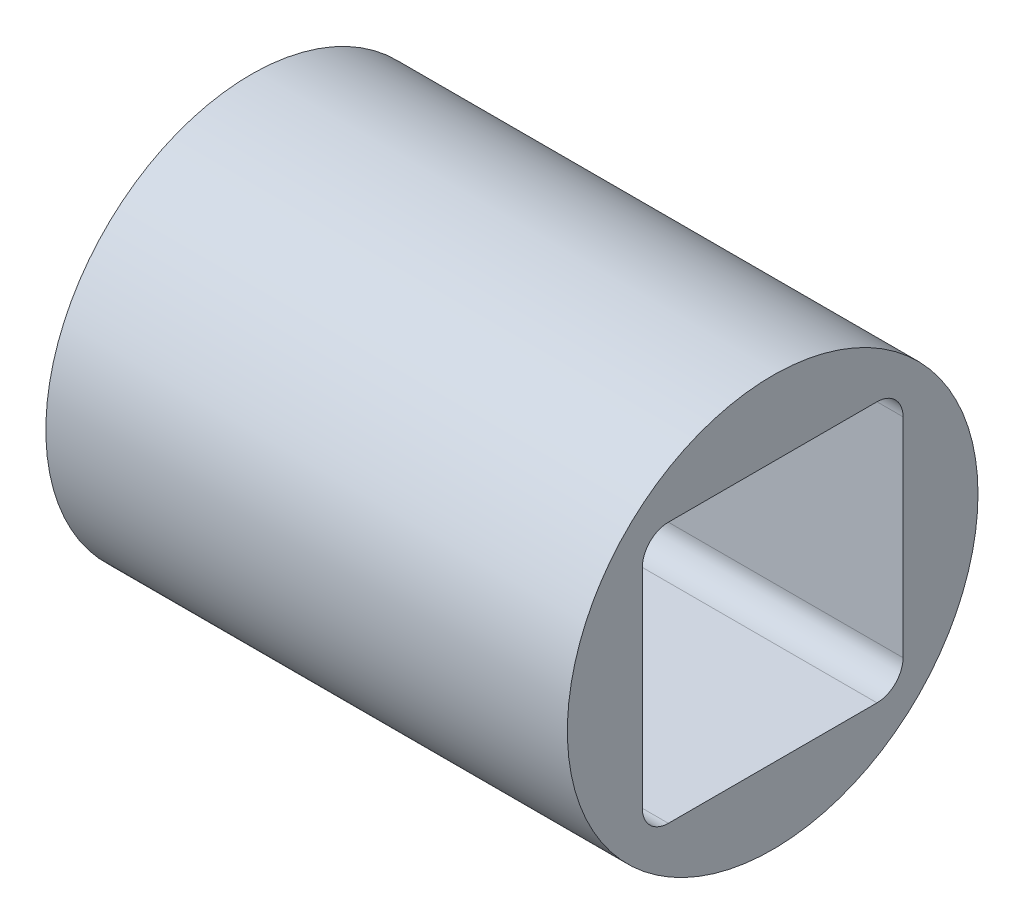
ISO-10303-21;
HEADER;
FILE_DESCRIPTION(('STEP AP214'),'2;1');
FILE_NAME('part.step','',(''),(''),'','','');
FILE_SCHEMA(('AUTOMOTIVE_DESIGN { 1 0 10303 214 1 1 1 1 }'));
ENDSEC;
DATA;
#1=APPLICATION_CONTEXT('core data for automotive mechanical design processes');
#2=APPLICATION_PROTOCOL_DEFINITION('international standard','automotive_design',2000,#1);
#3=PRODUCT_CONTEXT('',#1,'mechanical');
#4=PRODUCT('Part','Part','',(#3));
#5=PRODUCT_RELATED_PRODUCT_CATEGORY('part','',(#4));
#6=PRODUCT_DEFINITION_FORMATION('','',#4);
#7=PRODUCT_DEFINITION_CONTEXT('part definition',#1,'design');
#8=PRODUCT_DEFINITION('design','',#6,#7);
#9=PRODUCT_DEFINITION_SHAPE('','',#8);
#10=(LENGTH_UNIT() NAMED_UNIT(*) SI_UNIT(.MILLI.,.METRE.));
#11=(NAMED_UNIT(*) PLANE_ANGLE_UNIT() SI_UNIT($,.RADIAN.));
#12=(NAMED_UNIT(*) SI_UNIT($,.STERADIAN.) SOLID_ANGLE_UNIT());
#13=UNCERTAINTY_MEASURE_WITH_UNIT(LENGTH_MEASURE(1.E-05),#10,'distance_accuracy_value','');
#14=(GEOMETRIC_REPRESENTATION_CONTEXT(3) GLOBAL_UNCERTAINTY_ASSIGNED_CONTEXT((#13)) GLOBAL_UNIT_ASSIGNED_CONTEXT((#10,
#11,#12)) REPRESENTATION_CONTEXT('',''));
#15=CARTESIAN_POINT('',(0.,0.,0.));
#16=DIRECTION('',(0.,0.,1.));
#17=DIRECTION('',(1.,0.,0.));
#18=AXIS2_PLACEMENT_3D('',#15,#16,#17);
#19=CARTESIAN_POINT('',(12.7,0.,0.));
#20=DIRECTION('',(1.,0.,0.));
#21=DIRECTION('',(0.,0.,-1.));
#22=AXIS2_PLACEMENT_3D('',#19,#20,#21);
#23=PLANE('',#22);
#24=CARTESIAN_POINT('',(12.7,0.,0.));
#25=DIRECTION('',(1.,0.,0.));
#26=DIRECTION('',(0.,0.,-1.));
#27=AXIS2_PLACEMENT_3D('',#24,#25,#26);
#28=CIRCLE('',#27,5.);
#29=CARTESIAN_POINT('',(12.7,0.,-5.));
#30=VERTEX_POINT('',#29);
#31=EDGE_CURVE('E116',#30,#30,#28,.T.);
#32=ORIENTED_EDGE('',*,*,#31,.T.);
#33=EDGE_LOOP('',(#32));
#34=FACE_BOUND('',#33,.T.);
#35=DIRECTION('',(0.,0.,-1.));
#36=VECTOR('',#35,1.);
#37=CARTESIAN_POINT('',(12.7,-3.175,-3.175));
#38=LINE('',#37,#36);
#39=CARTESIAN_POINT('',(12.7,-3.175,2.54));
#40=VERTEX_POINT('',#39);
#41=CARTESIAN_POINT('',(12.7,-3.175,-2.54));
#42=VERTEX_POINT('',#41);
#43=EDGE_CURVE('E152',#40,#42,#38,.T.);
#44=ORIENTED_EDGE('',*,*,#43,.F.);
#45=CARTESIAN_POINT('',(12.7,-2.54,2.54));
#46=DIRECTION('',(1.,0.,0.));
#47=DIRECTION('',(0.,0.,-1.));
#48=AXIS2_PLACEMENT_3D('',#45,#46,#47);
#49=CIRCLE('',#48,0.635);
#50=CARTESIAN_POINT('',(12.7,-2.54,3.175));
#51=VERTEX_POINT('',#50);
#52=EDGE_CURVE('E106',#40,#51,#49,.F.);
#53=ORIENTED_EDGE('',*,*,#52,.T.);
#54=DIRECTION('',(0.,-1.,0.));
#55=VECTOR('',#54,1.);
#56=CARTESIAN_POINT('',(12.7,-3.175,3.175));
#57=LINE('',#56,#55);
#58=CARTESIAN_POINT('',(12.7,2.54,3.175));
#59=VERTEX_POINT('',#58);
#60=EDGE_CURVE('E150',#59,#51,#57,.T.);
#61=ORIENTED_EDGE('',*,*,#60,.F.);
#62=CARTESIAN_POINT('',(12.7,2.54,2.54));
#63=DIRECTION('',(1.,0.,0.));
#64=DIRECTION('',(0.,0.,-1.));
#65=AXIS2_PLACEMENT_3D('',#62,#63,#64);
#66=CIRCLE('',#65,0.635);
#67=CARTESIAN_POINT('',(12.7,3.175,2.54));
#68=VERTEX_POINT('',#67);
#69=EDGE_CURVE('E143',#59,#68,#66,.F.);
#70=ORIENTED_EDGE('',*,*,#69,.T.);
#71=DIRECTION('',(0.,0.,1.));
#72=VECTOR('',#71,1.);
#73=CARTESIAN_POINT('',(12.7,3.175,-3.175));
#74=LINE('',#73,#72);
#75=CARTESIAN_POINT('',(12.7,3.175,-2.54));
#76=VERTEX_POINT('',#75);
#77=EDGE_CURVE('E179',#76,#68,#74,.T.);
#78=ORIENTED_EDGE('',*,*,#77,.F.);
#79=CARTESIAN_POINT('',(12.7,2.54,-2.54));
#80=DIRECTION('',(1.,0.,0.));
#81=DIRECTION('',(0.,0.,-1.));
#82=AXIS2_PLACEMENT_3D('',#79,#80,#81);
#83=CIRCLE('',#82,0.635);
#84=CARTESIAN_POINT('',(12.7,2.54,-3.175));
#85=VERTEX_POINT('',#84);
#86=EDGE_CURVE('E139',#76,#85,#83,.F.);
#87=ORIENTED_EDGE('',*,*,#86,.T.);
#88=DIRECTION('',(0.,1.,0.));
#89=VECTOR('',#88,1.);
#90=CARTESIAN_POINT('',(12.7,-3.175,-3.175));
#91=LINE('',#90,#89);
#92=CARTESIAN_POINT('',(12.7,-2.54,-3.175));
#93=VERTEX_POINT('',#92);
#94=EDGE_CURVE('E178',#93,#85,#91,.T.);
#95=ORIENTED_EDGE('',*,*,#94,.F.);
#96=CARTESIAN_POINT('',(12.7,-2.54,-2.54));
#97=DIRECTION('',(1.,0.,0.));
#98=DIRECTION('',(0.,0.,-1.));
#99=AXIS2_PLACEMENT_3D('',#96,#97,#98);
#100=CIRCLE('',#99,0.635);
#101=EDGE_CURVE('E11',#93,#42,#100,.F.);
#102=ORIENTED_EDGE('',*,*,#101,.T.);
#103=EDGE_LOOP('',(#44,#53,#61,#70,#78,#87,#95,#102));
#104=FACE_BOUND('',#103,.T.);
#105=ADVANCED_FACE('F32',(#34,#104),#23,.T.);
#106=CARTESIAN_POINT('',(0.,0.,0.));
#107=DIRECTION('',(1.,0.,0.));
#108=DIRECTION('',(0.,0.,-1.));
#109=AXIS2_PLACEMENT_3D('',#106,#107,#108);
#110=PLANE('',#109);
#111=CARTESIAN_POINT('',(0.,0.,0.));
#112=DIRECTION('',(1.,0.,0.));
#113=DIRECTION('',(0.,0.,-1.));
#114=AXIS2_PLACEMENT_3D('',#111,#112,#113);
#115=CIRCLE('',#114,5.);
#116=CARTESIAN_POINT('',(0.,0.,-5.));
#117=VERTEX_POINT('',#116);
#118=EDGE_CURVE('E121',#117,#117,#115,.T.);
#119=ORIENTED_EDGE('',*,*,#118,.F.);
#120=EDGE_LOOP('',(#119));
#121=FACE_BOUND('',#120,.T.);
#122=DIRECTION('',(0.,0.,1.));
#123=VECTOR('',#122,1.);
#124=CARTESIAN_POINT('',(0.,3.175,-3.175));
#125=LINE('',#124,#123);
#126=CARTESIAN_POINT('',(0.,3.175,-2.54));
#127=VERTEX_POINT('',#126);
#128=CARTESIAN_POINT('',(0.,3.175,2.54));
#129=VERTEX_POINT('',#128);
#130=EDGE_CURVE('E114',#127,#129,#125,.T.);
#131=ORIENTED_EDGE('',*,*,#130,.T.);
#132=CARTESIAN_POINT('',(0.,2.54,2.54));
#133=DIRECTION('',(1.,0.,0.));
#134=DIRECTION('',(0.,0.,-1.));
#135=AXIS2_PLACEMENT_3D('',#132,#133,#134);
#136=CIRCLE('',#135,0.635);
#137=CARTESIAN_POINT('',(0.,2.54,3.175));
#138=VERTEX_POINT('',#137);
#139=EDGE_CURVE('E141',#129,#138,#136,.T.);
#140=ORIENTED_EDGE('',*,*,#139,.T.);
#141=DIRECTION('',(0.,-1.,0.));
#142=VECTOR('',#141,1.);
#143=CARTESIAN_POINT('',(0.,-3.175,3.175));
#144=LINE('',#143,#142);
#145=CARTESIAN_POINT('',(0.,-2.54,3.175));
#146=VERTEX_POINT('',#145);
#147=EDGE_CURVE('E162',#138,#146,#144,.T.);
#148=ORIENTED_EDGE('',*,*,#147,.T.);
#149=CARTESIAN_POINT('',(0.,-2.54,2.54));
#150=DIRECTION('',(1.,0.,0.));
#151=DIRECTION('',(0.,0.,-1.));
#152=AXIS2_PLACEMENT_3D('',#149,#150,#151);
#153=CIRCLE('',#152,0.635);
#154=CARTESIAN_POINT('',(0.,-3.175,2.54));
#155=VERTEX_POINT('',#154);
#156=EDGE_CURVE('E145',#146,#155,#153,.T.);
#157=ORIENTED_EDGE('',*,*,#156,.T.);
#158=DIRECTION('',(0.,0.,-1.));
#159=VECTOR('',#158,1.);
#160=CARTESIAN_POINT('',(0.,-3.175,-3.175));
#161=LINE('',#160,#159);
#162=CARTESIAN_POINT('',(0.,-3.175,-2.54));
#163=VERTEX_POINT('',#162);
#164=EDGE_CURVE('E101',#155,#163,#161,.T.);
#165=ORIENTED_EDGE('',*,*,#164,.T.);
#166=CARTESIAN_POINT('',(0.,-2.54,-2.54));
#167=DIRECTION('',(1.,0.,0.));
#168=DIRECTION('',(0.,0.,-1.));
#169=AXIS2_PLACEMENT_3D('',#166,#167,#168);
#170=CIRCLE('',#169,0.635);
#171=CARTESIAN_POINT('',(0.,-2.54,-3.175));
#172=VERTEX_POINT('',#171);
#173=EDGE_CURVE('E40',#163,#172,#170,.T.);
#174=ORIENTED_EDGE('',*,*,#173,.T.);
#175=DIRECTION('',(0.,1.,0.));
#176=VECTOR('',#175,1.);
#177=CARTESIAN_POINT('',(0.,-3.175,-3.175));
#178=LINE('',#177,#176);
#179=CARTESIAN_POINT('',(0.,2.54,-3.175));
#180=VERTEX_POINT('',#179);
#181=EDGE_CURVE('E100',#172,#180,#178,.T.);
#182=ORIENTED_EDGE('',*,*,#181,.T.);
#183=CARTESIAN_POINT('',(0.,2.54,-2.54));
#184=DIRECTION('',(1.,0.,0.));
#185=DIRECTION('',(0.,0.,-1.));
#186=AXIS2_PLACEMENT_3D('',#183,#184,#185);
#187=CIRCLE('',#186,0.635);
#188=EDGE_CURVE('E137',#180,#127,#187,.T.);
#189=ORIENTED_EDGE('',*,*,#188,.T.);
#190=EDGE_LOOP('',(#131,#140,#148,#157,#165,#174,#182,#189));
#191=FACE_BOUND('',#190,.T.);
#192=ADVANCED_FACE('F99',(#121,#191),#110,.F.);
#193=CARTESIAN_POINT('',(12.7,0.,0.));
#194=DIRECTION('',(-1.,0.,0.));
#195=DIRECTION('',(0.,0.,1.));
#196=AXIS2_PLACEMENT_3D('',#193,#194,#195);
#197=CYLINDRICAL_SURFACE('',#196,5.);
#198=ORIENTED_EDGE('',*,*,#31,.F.);
#199=EDGE_LOOP('',(#198));
#200=FACE_BOUND('',#199,.T.);
#201=ORIENTED_EDGE('',*,*,#118,.T.);
#202=EDGE_LOOP('',(#201));
#203=FACE_BOUND('',#202,.T.);
#204=ADVANCED_FACE('F185',(#200,#203),#197,.T.);
#205=CARTESIAN_POINT('',(12.7,-3.175,3.175));
#206=DIRECTION('',(0.,0.,-1.));
#207=DIRECTION('',(-1.,0.,0.));
#208=AXIS2_PLACEMENT_3D('',#205,#206,#207);
#209=PLANE('',#208);
#210=ORIENTED_EDGE('',*,*,#147,.F.);
#211=DIRECTION('',(-1.,0.,0.));
#212=VECTOR('',#211,1.);
#213=CARTESIAN_POINT('',(12.7,2.54,3.175));
#214=LINE('',#213,#212);
#215=EDGE_CURVE('E132',#138,#59,#214,.F.);
#216=ORIENTED_EDGE('',*,*,#215,.T.);
#217=ORIENTED_EDGE('',*,*,#60,.T.);
#218=DIRECTION('',(-1.,0.,0.));
#219=VECTOR('',#218,1.);
#220=CARTESIAN_POINT('',(0.,-2.54,3.175));
#221=LINE('',#220,#219);
#222=EDGE_CURVE('E129',#51,#146,#221,.T.);
#223=ORIENTED_EDGE('',*,*,#222,.T.);
#224=EDGE_LOOP('',(#210,#216,#217,#223));
#225=FACE_BOUND('',#224,.T.);
#226=ADVANCED_FACE('F157',(#225),#209,.T.);
#227=CARTESIAN_POINT('',(12.7,-3.175,-3.175));
#228=DIRECTION('',(0.,1.,0.));
#229=DIRECTION('',(0.,0.,1.));
#230=AXIS2_PLACEMENT_3D('',#227,#228,#229);
#231=PLANE('',#230);
#232=ORIENTED_EDGE('',*,*,#164,.F.);
#233=DIRECTION('',(-1.,0.,0.));
#234=VECTOR('',#233,1.);
#235=CARTESIAN_POINT('',(12.7,-3.175,2.54));
#236=LINE('',#235,#234);
#237=EDGE_CURVE('E52',#155,#40,#236,.F.);
#238=ORIENTED_EDGE('',*,*,#237,.T.);
#239=ORIENTED_EDGE('',*,*,#43,.T.);
#240=DIRECTION('',(-1.,0.,0.));
#241=VECTOR('',#240,1.);
#242=CARTESIAN_POINT('',(0.,-3.175,-2.54));
#243=LINE('',#242,#241);
#244=EDGE_CURVE('E134',#42,#163,#243,.T.);
#245=ORIENTED_EDGE('',*,*,#244,.T.);
#246=EDGE_LOOP('',(#232,#238,#239,#245));
#247=FACE_BOUND('',#246,.T.);
#248=ADVANCED_FACE('F163',(#247),#231,.T.);
#249=CARTESIAN_POINT('',(12.7,-3.175,-3.175));
#250=DIRECTION('',(0.,0.,1.));
#251=DIRECTION('',(1.,0.,0.));
#252=AXIS2_PLACEMENT_3D('',#249,#250,#251);
#253=PLANE('',#252);
#254=ORIENTED_EDGE('',*,*,#94,.T.);
#255=DIRECTION('',(-1.,0.,0.));
#256=VECTOR('',#255,1.);
#257=CARTESIAN_POINT('',(0.,2.54,-3.175));
#258=LINE('',#257,#256);
#259=EDGE_CURVE('E113',#85,#180,#258,.T.);
#260=ORIENTED_EDGE('',*,*,#259,.T.);
#261=ORIENTED_EDGE('',*,*,#181,.F.);
#262=DIRECTION('',(-1.,0.,0.));
#263=VECTOR('',#262,1.);
#264=CARTESIAN_POINT('',(12.7,-2.54,-3.175));
#265=LINE('',#264,#263);
#266=EDGE_CURVE('E111',#172,#93,#265,.F.);
#267=ORIENTED_EDGE('',*,*,#266,.T.);
#268=EDGE_LOOP('',(#254,#260,#261,#267));
#269=FACE_BOUND('',#268,.T.);
#270=ADVANCED_FACE('F110',(#269),#253,.T.);
#271=CARTESIAN_POINT('',(12.7,3.175,-3.175));
#272=DIRECTION('',(0.,-1.,0.));
#273=DIRECTION('',(0.,0.,-1.));
#274=AXIS2_PLACEMENT_3D('',#271,#272,#273);
#275=PLANE('',#274);
#276=ORIENTED_EDGE('',*,*,#130,.F.);
#277=DIRECTION('',(-1.,0.,0.));
#278=VECTOR('',#277,1.);
#279=CARTESIAN_POINT('',(12.7,3.175,-2.54));
#280=LINE('',#279,#278);
#281=EDGE_CURVE('E127',#127,#76,#280,.F.);
#282=ORIENTED_EDGE('',*,*,#281,.T.);
#283=ORIENTED_EDGE('',*,*,#77,.T.);
#284=DIRECTION('',(-1.,0.,0.));
#285=VECTOR('',#284,1.);
#286=CARTESIAN_POINT('',(0.,3.175,2.54));
#287=LINE('',#286,#285);
#288=EDGE_CURVE('E118',#68,#129,#287,.T.);
#289=ORIENTED_EDGE('',*,*,#288,.T.);
#290=EDGE_LOOP('',(#276,#282,#283,#289));
#291=FACE_BOUND('',#290,.T.);
#292=ADVANCED_FACE('F171',(#291),#275,.T.);
#293=CARTESIAN_POINT('',(12.7,2.54,-2.54));
#294=DIRECTION('',(1.,0.,0.));
#295=DIRECTION('',(0.,0.,-1.));
#296=AXIS2_PLACEMENT_3D('',#293,#294,#295);
#297=CYLINDRICAL_SURFACE('',#296,0.635);
#298=ORIENTED_EDGE('',*,*,#86,.F.);
#299=ORIENTED_EDGE('',*,*,#281,.F.);
#300=ORIENTED_EDGE('',*,*,#188,.F.);
#301=ORIENTED_EDGE('',*,*,#259,.F.);
#302=EDGE_LOOP('',(#298,#299,#300,#301));
#303=FACE_BOUND('',#302,.T.);
#304=ADVANCED_FACE('F177',(#303),#297,.F.);
#305=CARTESIAN_POINT('',(12.7,2.54,2.54));
#306=DIRECTION('',(1.,0.,0.));
#307=DIRECTION('',(0.,0.,-1.));
#308=AXIS2_PLACEMENT_3D('',#305,#306,#307);
#309=CYLINDRICAL_SURFACE('',#308,0.635);
#310=ORIENTED_EDGE('',*,*,#69,.F.);
#311=ORIENTED_EDGE('',*,*,#215,.F.);
#312=ORIENTED_EDGE('',*,*,#139,.F.);
#313=ORIENTED_EDGE('',*,*,#288,.F.);
#314=EDGE_LOOP('',(#310,#311,#312,#313));
#315=FACE_BOUND('',#314,.T.);
#316=ADVANCED_FACE('F201',(#315),#309,.F.);
#317=CARTESIAN_POINT('',(12.7,-2.54,2.54));
#318=DIRECTION('',(1.,0.,0.));
#319=DIRECTION('',(0.,0.,-1.));
#320=AXIS2_PLACEMENT_3D('',#317,#318,#319);
#321=CYLINDRICAL_SURFACE('',#320,0.635);
#322=ORIENTED_EDGE('',*,*,#52,.F.);
#323=ORIENTED_EDGE('',*,*,#237,.F.);
#324=ORIENTED_EDGE('',*,*,#156,.F.);
#325=ORIENTED_EDGE('',*,*,#222,.F.);
#326=EDGE_LOOP('',(#322,#323,#324,#325));
#327=FACE_BOUND('',#326,.T.);
#328=ADVANCED_FACE('F161',(#327),#321,.F.);
#329=CARTESIAN_POINT('',(12.7,-2.54,-2.54));
#330=DIRECTION('',(1.,0.,0.));
#331=DIRECTION('',(0.,0.,-1.));
#332=AXIS2_PLACEMENT_3D('',#329,#330,#331);
#333=CYLINDRICAL_SURFACE('',#332,0.635);
#334=ORIENTED_EDGE('',*,*,#101,.F.);
#335=ORIENTED_EDGE('',*,*,#266,.F.);
#336=ORIENTED_EDGE('',*,*,#173,.F.);
#337=ORIENTED_EDGE('',*,*,#244,.F.);
#338=EDGE_LOOP('',(#334,#335,#336,#337));
#339=FACE_BOUND('',#338,.T.);
#340=ADVANCED_FACE('F34',(#339),#333,.F.);
#341=CLOSED_SHELL('',(#105,#192,#204,#226,#248,#270,#292,#304,#316,#328,#340));
#342=MANIFOLD_SOLID_BREP('B2',#341);
#343=ADVANCED_BREP_SHAPE_REPRESENTATION('',(#18,#342),#14);
#344=SHAPE_DEFINITION_REPRESENTATION(#9,#343);
ENDSEC;
END-ISO-10303-21;
